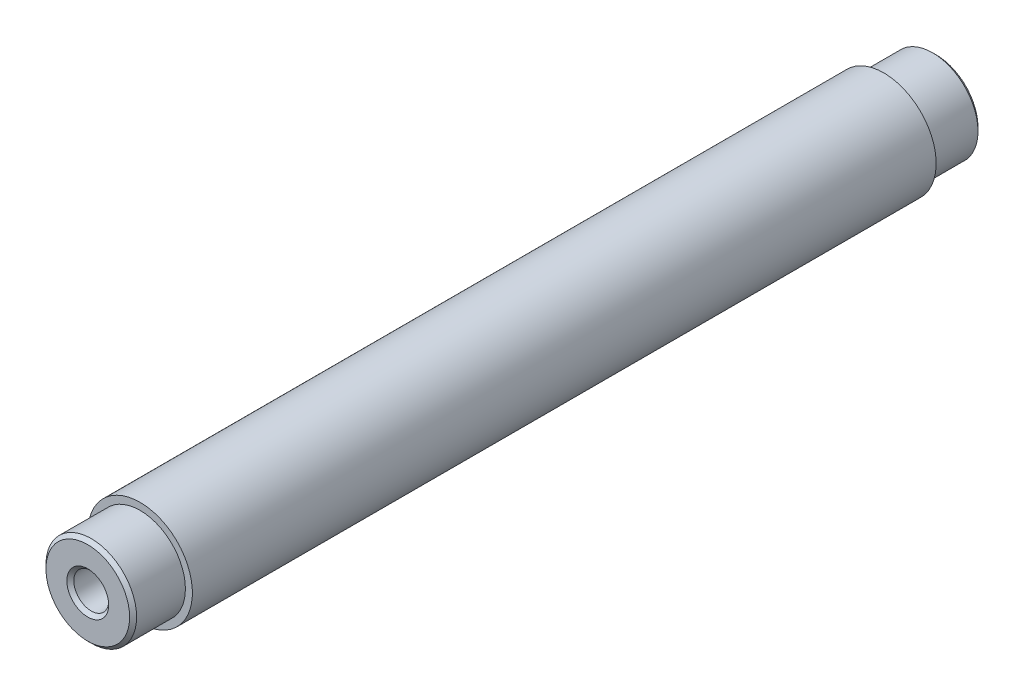
ISO-10303-21;
HEADER;
FILE_DESCRIPTION(('STEP AP214'),'2;1');
FILE_NAME('part.step','',(''),(''),'','','');
FILE_SCHEMA(('AUTOMOTIVE_DESIGN { 1 0 10303 214 1 1 1 1 }'));
ENDSEC;
DATA;
#1=APPLICATION_CONTEXT('core data for automotive mechanical design processes');
#2=APPLICATION_PROTOCOL_DEFINITION('international standard','automotive_design',2000,#1);
#3=PRODUCT_CONTEXT('',#1,'mechanical');
#4=PRODUCT('Part','Part','',(#3));
#5=PRODUCT_RELATED_PRODUCT_CATEGORY('part','',(#4));
#6=PRODUCT_DEFINITION_FORMATION('','',#4);
#7=PRODUCT_DEFINITION_CONTEXT('part definition',#1,'design');
#8=PRODUCT_DEFINITION('design','',#6,#7);
#9=PRODUCT_DEFINITION_SHAPE('','',#8);
#10=(LENGTH_UNIT() NAMED_UNIT(*) SI_UNIT(.MILLI.,.METRE.));
#11=(NAMED_UNIT(*) PLANE_ANGLE_UNIT() SI_UNIT($,.RADIAN.));
#12=(NAMED_UNIT(*) SI_UNIT($,.STERADIAN.) SOLID_ANGLE_UNIT());
#13=UNCERTAINTY_MEASURE_WITH_UNIT(LENGTH_MEASURE(1.E-05),#10,'distance_accuracy_value','');
#14=(GEOMETRIC_REPRESENTATION_CONTEXT(3) GLOBAL_UNCERTAINTY_ASSIGNED_CONTEXT((#13)) GLOBAL_UNIT_ASSIGNED_CONTEXT((#10,
#11,#12)) REPRESENTATION_CONTEXT('',''));
#15=CARTESIAN_POINT('',(0.,0.,0.));
#16=DIRECTION('',(0.,0.,1.));
#17=DIRECTION('',(1.,0.,0.));
#18=AXIS2_PLACEMENT_3D('',#15,#16,#17);
#19=CARTESIAN_POINT('',(0.,0.,60.825));
#20=DIRECTION('',(0.,0.,-1.));
#21=DIRECTION('',(-1.,0.,0.));
#22=AXIS2_PLACEMENT_3D('',#19,#20,#21);
#23=CYLINDRICAL_SURFACE('',#22,7.5);
#24=CARTESIAN_POINT('',(0.,0.,-53.325));
#25=DIRECTION('',(0.,0.,-1.));
#26=DIRECTION('',(-1.,0.,0.));
#27=AXIS2_PLACEMENT_3D('',#24,#25,#26);
#28=CIRCLE('',#27,7.5);
#29=CARTESIAN_POINT('',(-7.5,0.,-53.325));
#30=VERTEX_POINT('',#29);
#31=EDGE_CURVE('E89',#30,#30,#28,.T.);
#32=CARTESIAN_POINT('',(0.,0.,53.325));
#33=DIRECTION('',(0.,0.,-1.));
#34=DIRECTION('',(-1.,0.,0.));
#35=AXIS2_PLACEMENT_3D('',#32,#33,#34);
#36=CIRCLE('',#35,7.5);
#37=CARTESIAN_POINT('',(-7.5,0.,53.325));
#38=VERTEX_POINT('',#37);
#39=EDGE_CURVE('E79',#38,#38,#36,.T.);
#40=CARTESIAN_POINT('',(-7.5,0.,-53.325));
#41=CARTESIAN_POINT('',(-7.5,0.,-52.2140625));
#42=CARTESIAN_POINT('',(-7.5,0.,-51.103125));
#43=CARTESIAN_POINT('',(-7.5,0.,-48.88125));
#44=CARTESIAN_POINT('',(-7.5,0.,-47.7703125));
#45=CARTESIAN_POINT('',(-7.5,0.,-45.5484375));
#46=CARTESIAN_POINT('',(-7.5,0.,-44.4375));
#47=CARTESIAN_POINT('',(-7.5,0.,-42.215625));
#48=CARTESIAN_POINT('',(-7.5,0.,-41.1046875));
#49=CARTESIAN_POINT('',(-7.5,0.,-38.8828125));
#50=CARTESIAN_POINT('',(-7.5,0.,-37.771875));
#51=CARTESIAN_POINT('',(-7.5,0.,-35.55));
#52=CARTESIAN_POINT('',(-7.5,0.,-34.4390625));
#53=CARTESIAN_POINT('',(-7.5,0.,-32.2171875));
#54=CARTESIAN_POINT('',(-7.5,0.,-31.10625));
#55=CARTESIAN_POINT('',(-7.5,0.,-28.884375));
#56=CARTESIAN_POINT('',(-7.5,0.,-27.7734375));
#57=CARTESIAN_POINT('',(-7.5,0.,-25.5515625));
#58=CARTESIAN_POINT('',(-7.5,0.,-24.440625));
#59=CARTESIAN_POINT('',(-7.5,0.,-22.21875));
#60=CARTESIAN_POINT('',(-7.5,0.,-21.1078125));
#61=CARTESIAN_POINT('',(-7.5,0.,-18.8859375));
#62=CARTESIAN_POINT('',(-7.5,0.,-17.775));
#63=CARTESIAN_POINT('',(-7.5,0.,-15.553125));
#64=CARTESIAN_POINT('',(-7.5,0.,-14.4421875));
#65=CARTESIAN_POINT('',(-7.5,0.,-12.2203125));
#66=CARTESIAN_POINT('',(-7.5,0.,-11.109375));
#67=CARTESIAN_POINT('',(-7.5,0.,-8.8875));
#68=CARTESIAN_POINT('',(-7.5,0.,-7.7765625));
#69=CARTESIAN_POINT('',(-7.5,0.,-5.5546875));
#70=CARTESIAN_POINT('',(-7.5,0.,-4.44375));
#71=CARTESIAN_POINT('',(-7.5,0.,-2.221875));
#72=CARTESIAN_POINT('',(-7.5,0.,-1.1109375));
#73=CARTESIAN_POINT('',(-7.5,0.,1.1109375));
#74=CARTESIAN_POINT('',(-7.5,0.,2.221875));
#75=CARTESIAN_POINT('',(-7.5,0.,4.44375));
#76=CARTESIAN_POINT('',(-7.5,0.,5.5546875));
#77=CARTESIAN_POINT('',(-7.5,0.,7.7765625));
#78=CARTESIAN_POINT('',(-7.5,0.,8.8875));
#79=CARTESIAN_POINT('',(-7.5,0.,11.109375));
#80=CARTESIAN_POINT('',(-7.5,0.,12.2203125));
#81=CARTESIAN_POINT('',(-7.5,0.,14.4421875));
#82=CARTESIAN_POINT('',(-7.5,0.,15.553125));
#83=CARTESIAN_POINT('',(-7.5,0.,17.775));
#84=CARTESIAN_POINT('',(-7.5,0.,18.8859375));
#85=CARTESIAN_POINT('',(-7.5,0.,21.1078125));
#86=CARTESIAN_POINT('',(-7.5,0.,22.21875));
#87=CARTESIAN_POINT('',(-7.5,0.,24.440625));
#88=CARTESIAN_POINT('',(-7.5,0.,25.5515625));
#89=CARTESIAN_POINT('',(-7.5,0.,27.7734375));
#90=CARTESIAN_POINT('',(-7.5,0.,28.884375));
#91=CARTESIAN_POINT('',(-7.5,0.,31.10625));
#92=CARTESIAN_POINT('',(-7.5,0.,32.2171875));
#93=CARTESIAN_POINT('',(-7.5,0.,34.4390625));
#94=CARTESIAN_POINT('',(-7.5,0.,35.55));
#95=CARTESIAN_POINT('',(-7.5,0.,37.771875));
#96=CARTESIAN_POINT('',(-7.5,0.,38.8828125));
#97=CARTESIAN_POINT('',(-7.5,0.,41.1046875));
#98=CARTESIAN_POINT('',(-7.5,0.,42.215625));
#99=CARTESIAN_POINT('',(-7.5,0.,44.4375));
#100=CARTESIAN_POINT('',(-7.5,0.,45.5484375));
#101=CARTESIAN_POINT('',(-7.5,0.,47.7703125));
#102=CARTESIAN_POINT('',(-7.5,0.,48.88125));
#103=CARTESIAN_POINT('',(-7.5,0.,51.103125));
#104=CARTESIAN_POINT('',(-7.5,0.,52.2140625));
#105=CARTESIAN_POINT('',(-7.5,0.,53.325));
#106=B_SPLINE_CURVE_WITH_KNOTS('',3,(#40,#41,#42,#43,#44,#45,#46,#47,#48,#49,#50,#51,#52,#53,
#54,#55,#56,#57,#58,#59,#60,#61,#62,#63,#64,#65,#66,#67,#68,#69,#70,#71,#72,#73,#74,#75,#76,#77,
#78,#79,#80,#81,#82,#83,#84,#85,#86,#87,#88,#89,#90,#91,#92,#93,#94,#95,#96,#97,#98,#99,#100,
#101,#102,#103,#104,#105),.UNSPECIFIED.,.F.,.F.,(4,2,2,2,2,2,2,2,2,2,2,2,2,2,2,2,2,2,2,2,2,2,2,
2,2,2,2,2,2,2,2,2,4),(0.,3.3328125,6.66562500000001,9.9984375,13.33125,16.6640625,19.996875,
23.3296875,26.6625,29.9953125,33.328125,36.6609375,39.99375,43.3265625,46.659375,49.9921875,
53.325,56.6578125,59.990625,63.3234375,66.65625,69.9890625,73.321875,76.6546875,79.9875,
83.3203125,86.653125,89.9859375,93.31875,96.6515625,99.984375,103.3171875,106.65),.UNSPECIFIED.);
#107=EDGE_CURVE('BSEAM51',#30,#38,#106,.T.);
#108=ORIENTED_EDGE('',*,*,#31,.F.);
#109=ORIENTED_EDGE('',*,*,#39,.T.);
#110=ORIENTED_EDGE('',*,*,#107,.T.);
#111=ORIENTED_EDGE('',*,*,#107,.F.);
#112=EDGE_LOOP('',(#108,#110,#109,#111));
#113=FACE_BOUND('',#112,.T.);
#114=ADVANCED_FACE('F51',(#113),#23,.T.);
#115=CARTESIAN_POINT('',(0.,0.,-53.325));
#116=DIRECTION('',(0.,0.,-1.));
#117=DIRECTION('',(-1.,0.,0.));
#118=AXIS2_PLACEMENT_3D('',#115,#116,#117);
#119=CYLINDRICAL_SURFACE('',#118,6.5);
#120=CARTESIAN_POINT('',(0.,0.,-60.325));
#121=DIRECTION('',(0.,0.,1.));
#122=DIRECTION('',(1.,0.,0.));
#123=AXIS2_PLACEMENT_3D('',#120,#121,#122);
#124=CIRCLE('',#123,6.5);
#125=CARTESIAN_POINT('',(6.5,0.,-60.325));
#126=VERTEX_POINT('',#125);
#127=EDGE_CURVE('E100',#126,#126,#124,.T.);
#128=ORIENTED_EDGE('',*,*,#127,.T.);
#129=EDGE_LOOP('',(#128));
#130=FACE_BOUND('',#129,.T.);
#131=CARTESIAN_POINT('',(0.,0.,-53.325));
#132=DIRECTION('',(0.,0.,-1.));
#133=DIRECTION('',(-1.,0.,0.));
#134=AXIS2_PLACEMENT_3D('',#131,#132,#133);
#135=CIRCLE('',#134,6.5);
#136=CARTESIAN_POINT('',(-6.5,0.,-53.325));
#137=VERTEX_POINT('',#136);
#138=EDGE_CURVE('E90',#137,#137,#135,.T.);
#139=ORIENTED_EDGE('',*,*,#138,.T.);
#140=EDGE_LOOP('',(#139));
#141=FACE_BOUND('',#140,.T.);
#142=ADVANCED_FACE('F133',(#130,#141),#119,.T.);
#143=CARTESIAN_POINT('',(0.,0.,-53.325));
#144=DIRECTION('',(0.,0.,-1.));
#145=DIRECTION('',(-1.,0.,0.));
#146=AXIS2_PLACEMENT_3D('',#143,#144,#145);
#147=PLANE('',#146);
#148=ORIENTED_EDGE('',*,*,#138,.F.);
#149=EDGE_LOOP('',(#148));
#150=FACE_BOUND('',#149,.T.);
#151=ORIENTED_EDGE('',*,*,#31,.T.);
#152=EDGE_LOOP('',(#151));
#153=FACE_BOUND('',#152,.T.);
#154=ADVANCED_FACE('F136',(#150,#153),#147,.T.);
#155=CARTESIAN_POINT('',(0.,0.,-60.825));
#156=DIRECTION('',(0.,0.,1.));
#157=DIRECTION('',(1.,0.,0.));
#158=AXIS2_PLACEMENT_3D('',#155,#156,#157);
#159=PLANE('',#158);
#160=CARTESIAN_POINT('',(0.,0.,-60.825));
#161=DIRECTION('',(0.,0.,1.));
#162=DIRECTION('',(1.,0.,0.));
#163=AXIS2_PLACEMENT_3D('',#160,#161,#162);
#164=CIRCLE('',#163,5.99999999999999);
#165=CARTESIAN_POINT('',(5.99999999999999,0.,-60.825));
#166=VERTEX_POINT('',#165);
#167=EDGE_CURVE('E98',#166,#166,#164,.F.);
#168=ORIENTED_EDGE('',*,*,#167,.T.);
#169=EDGE_LOOP('',(#168));
#170=FACE_BOUND('',#169,.T.);
#171=CARTESIAN_POINT('',(0.,0.,-60.825));
#172=DIRECTION('',(0.,0.,1.));
#173=DIRECTION('',(1.,0.,0.));
#174=AXIS2_PLACEMENT_3D('',#171,#172,#173);
#175=CIRCLE('',#174,3.);
#176=CARTESIAN_POINT('',(3.,0.,-60.825));
#177=VERTEX_POINT('',#176);
#178=EDGE_CURVE('E94',#177,#177,#175,.T.);
#179=ORIENTED_EDGE('',*,*,#178,.T.);
#180=EDGE_LOOP('',(#179));
#181=FACE_BOUND('',#180,.T.);
#182=ADVANCED_FACE('F147',(#170,#181),#159,.F.);
#183=CARTESIAN_POINT('',(0.,0.,-45.3271515475689));
#184=DIRECTION('',(0.,0.,-1.));
#185=DIRECTION('',(-1.,0.,0.));
#186=AXIS2_PLACEMENT_3D('',#183,#184,#185);
#187=CONICAL_SURFACE('',#186,2.5,1.02974425867665);
#188=CARTESIAN_POINT('',(0.,0.,-43.825));
#189=VERTEX_POINT('',#188);
#190=VERTEX_LOOP('',#189);
#191=FACE_BOUND('',#190,.T.);
#192=CARTESIAN_POINT('',(0.,0.,-45.3271515475689));
#193=DIRECTION('',(0.,0.,-1.));
#194=DIRECTION('',(-1.,0.,0.));
#195=AXIS2_PLACEMENT_3D('',#192,#193,#194);
#196=CIRCLE('',#195,2.5);
#197=CARTESIAN_POINT('',(-2.5,0.,-45.3271515475689));
#198=VERTEX_POINT('',#197);
#199=EDGE_CURVE('E81',#198,#198,#196,.T.);
#200=ORIENTED_EDGE('',*,*,#199,.T.);
#201=EDGE_LOOP('',(#200));
#202=FACE_BOUND('',#201,.T.);
#203=ADVANCED_FACE('F167',(#191,#202),#187,.F.);
#204=CARTESIAN_POINT('',(0.,0.,-60.825));
#205=DIRECTION('',(0.,0.,-1.));
#206=DIRECTION('',(-1.,0.,0.));
#207=AXIS2_PLACEMENT_3D('',#204,#205,#206);
#208=CYLINDRICAL_SURFACE('',#207,2.5);
#209=CARTESIAN_POINT('',(0.,0.,-60.325));
#210=DIRECTION('',(0.,0.,1.));
#211=DIRECTION('',(1.,0.,0.));
#212=AXIS2_PLACEMENT_3D('',#209,#210,#211);
#213=CIRCLE('',#212,2.5);
#214=CARTESIAN_POINT('',(2.5,0.,-60.325));
#215=VERTEX_POINT('',#214);
#216=EDGE_CURVE('E11',#215,#215,#213,.F.);
#217=ORIENTED_EDGE('',*,*,#216,.T.);
#218=EDGE_LOOP('',(#217));
#219=FACE_BOUND('',#218,.T.);
#220=ORIENTED_EDGE('',*,*,#199,.F.);
#221=EDGE_LOOP('',(#220));
#222=FACE_BOUND('',#221,.T.);
#223=ADVANCED_FACE('F174',(#219,#222),#208,.F.);
#224=CARTESIAN_POINT('',(0.,0.,53.325));
#225=DIRECTION('',(0.,0.,1.));
#226=DIRECTION('',(1.,0.,0.));
#227=AXIS2_PLACEMENT_3D('',#224,#225,#226);
#228=CYLINDRICAL_SURFACE('',#227,6.5);
#229=CARTESIAN_POINT('',(0.,0.,60.325));
#230=DIRECTION('',(0.,0.,1.));
#231=DIRECTION('',(1.,0.,0.));
#232=AXIS2_PLACEMENT_3D('',#229,#230,#231);
#233=CIRCLE('',#232,6.5);
#234=CARTESIAN_POINT('',(6.5,0.,60.325));
#235=VERTEX_POINT('',#234);
#236=EDGE_CURVE('E105',#235,#235,#233,.F.);
#237=ORIENTED_EDGE('',*,*,#236,.T.);
#238=EDGE_LOOP('',(#237));
#239=FACE_BOUND('',#238,.T.);
#240=CARTESIAN_POINT('',(0.,0.,53.325));
#241=DIRECTION('',(0.,0.,-1.));
#242=DIRECTION('',(-1.,0.,0.));
#243=AXIS2_PLACEMENT_3D('',#240,#241,#242);
#244=CIRCLE('',#243,6.5);
#245=CARTESIAN_POINT('',(-6.5,0.,53.325));
#246=VERTEX_POINT('',#245);
#247=EDGE_CURVE('E77',#246,#246,#244,.T.);
#248=ORIENTED_EDGE('',*,*,#247,.F.);
#249=EDGE_LOOP('',(#248));
#250=FACE_BOUND('',#249,.T.);
#251=ADVANCED_FACE('F178',(#239,#250),#228,.T.);
#252=CARTESIAN_POINT('',(0.,0.,53.325));
#253=DIRECTION('',(0.,0.,1.));
#254=DIRECTION('',(-1.,0.,0.));
#255=AXIS2_PLACEMENT_3D('',#252,#253,#254);
#256=PLANE('',#255);
#257=ORIENTED_EDGE('',*,*,#247,.T.);
#258=EDGE_LOOP('',(#257));
#259=FACE_BOUND('',#258,.T.);
#260=ORIENTED_EDGE('',*,*,#39,.F.);
#261=EDGE_LOOP('',(#260));
#262=FACE_BOUND('',#261,.T.);
#263=ADVANCED_FACE('F186',(#259,#262),#256,.T.);
#264=CARTESIAN_POINT('',(0.,0.,60.825));
#265=DIRECTION('',(0.,0.,1.));
#266=DIRECTION('',(1.,0.,0.));
#267=AXIS2_PLACEMENT_3D('',#264,#265,#266);
#268=PLANE('',#267);
#269=CARTESIAN_POINT('',(0.,0.,60.825));
#270=DIRECTION('',(0.,0.,1.));
#271=DIRECTION('',(1.,0.,0.));
#272=AXIS2_PLACEMENT_3D('',#269,#270,#271);
#273=CIRCLE('',#272,5.99999999999999);
#274=CARTESIAN_POINT('',(5.99999999999999,0.,60.825));
#275=VERTEX_POINT('',#274);
#276=EDGE_CURVE('E108',#275,#275,#273,.T.);
#277=ORIENTED_EDGE('',*,*,#276,.T.);
#278=EDGE_LOOP('',(#277));
#279=FACE_BOUND('',#278,.T.);
#280=CARTESIAN_POINT('',(0.,0.,60.825));
#281=DIRECTION('',(0.,0.,1.));
#282=DIRECTION('',(1.,0.,0.));
#283=AXIS2_PLACEMENT_3D('',#280,#281,#282);
#284=CIRCLE('',#283,3.);
#285=CARTESIAN_POINT('',(3.,0.,60.825));
#286=VERTEX_POINT('',#285);
#287=EDGE_CURVE('E102',#286,#286,#284,.F.);
#288=ORIENTED_EDGE('',*,*,#287,.T.);
#289=EDGE_LOOP('',(#288));
#290=FACE_BOUND('',#289,.T.);
#291=ADVANCED_FACE('F69',(#279,#290),#268,.T.);
#292=CARTESIAN_POINT('',(0.,0.,45.3271515475689));
#293=DIRECTION('',(0.,0.,1.));
#294=DIRECTION('',(1.,0.,0.));
#295=AXIS2_PLACEMENT_3D('',#292,#293,#294);
#296=CONICAL_SURFACE('',#295,2.5,1.02974425867665);
#297=CARTESIAN_POINT('',(0.,0.,43.825));
#298=VERTEX_POINT('',#297);
#299=VERTEX_LOOP('',#298);
#300=FACE_BOUND('',#299,.T.);
#301=CARTESIAN_POINT('',(0.,0.,45.3271515475689));
#302=DIRECTION('',(0.,0.,1.));
#303=DIRECTION('',(1.,0.,0.));
#304=AXIS2_PLACEMENT_3D('',#301,#302,#303);
#305=CIRCLE('',#304,2.5);
#306=CARTESIAN_POINT('',(2.5,0.,45.3271515475689));
#307=VERTEX_POINT('',#306);
#308=EDGE_CURVE('E71',#307,#307,#305,.T.);
#309=ORIENTED_EDGE('',*,*,#308,.T.);
#310=EDGE_LOOP('',(#309));
#311=FACE_BOUND('',#310,.T.);
#312=ADVANCED_FACE('F68',(#300,#311),#296,.F.);
#313=CARTESIAN_POINT('',(0.,0.,60.825));
#314=DIRECTION('',(0.,0.,1.));
#315=DIRECTION('',(1.,0.,0.));
#316=AXIS2_PLACEMENT_3D('',#313,#314,#315);
#317=CYLINDRICAL_SURFACE('',#316,2.5);
#318=CARTESIAN_POINT('',(0.,0.,60.325));
#319=DIRECTION('',(0.,0.,1.));
#320=DIRECTION('',(1.,0.,0.));
#321=AXIS2_PLACEMENT_3D('',#318,#319,#320);
#322=CIRCLE('',#321,2.5);
#323=CARTESIAN_POINT('',(2.5,0.,60.325));
#324=VERTEX_POINT('',#323);
#325=EDGE_CURVE('E58',#324,#324,#322,.T.);
#326=ORIENTED_EDGE('',*,*,#325,.T.);
#327=EDGE_LOOP('',(#326));
#328=FACE_BOUND('',#327,.T.);
#329=ORIENTED_EDGE('',*,*,#308,.F.);
#330=EDGE_LOOP('',(#329));
#331=FACE_BOUND('',#330,.T.);
#332=ADVANCED_FACE('F67',(#328,#331),#317,.F.);
#333=CARTESIAN_POINT('',(0.,0.,-60.825));
#334=DIRECTION('',(0.,0.,1.));
#335=DIRECTION('',(1.,0.,0.));
#336=AXIS2_PLACEMENT_3D('',#333,#334,#335);
#337=CONICAL_SURFACE('',#336,5.99999999999999,0.785398163397442);
#338=ORIENTED_EDGE('',*,*,#127,.F.);
#339=EDGE_LOOP('',(#338));
#340=FACE_BOUND('',#339,.T.);
#341=ORIENTED_EDGE('',*,*,#167,.F.);
#342=EDGE_LOOP('',(#341));
#343=FACE_BOUND('',#342,.T.);
#344=ADVANCED_FACE('F123',(#340,#343),#337,.T.);
#345=CARTESIAN_POINT('',(0.,0.,60.325));
#346=DIRECTION('',(0.,0.,-1.));
#347=DIRECTION('',(-1.,0.,0.));
#348=AXIS2_PLACEMENT_3D('',#345,#346,#347);
#349=CONICAL_SURFACE('',#348,6.5,0.785398163397456);
#350=ORIENTED_EDGE('',*,*,#276,.F.);
#351=EDGE_LOOP('',(#350));
#352=FACE_BOUND('',#351,.T.);
#353=ORIENTED_EDGE('',*,*,#236,.F.);
#354=EDGE_LOOP('',(#353));
#355=FACE_BOUND('',#354,.T.);
#356=ADVANCED_FACE('F116',(#352,#355),#349,.T.);
#357=CARTESIAN_POINT('',(0.,0.,60.325));
#358=DIRECTION('',(0.,0.,1.));
#359=DIRECTION('',(1.,0.,0.));
#360=AXIS2_PLACEMENT_3D('',#357,#358,#359);
#361=CONICAL_SURFACE('',#360,2.5,0.78539816339744);
#362=ORIENTED_EDGE('',*,*,#287,.F.);
#363=EDGE_LOOP('',(#362));
#364=FACE_BOUND('',#363,.T.);
#365=ORIENTED_EDGE('',*,*,#325,.F.);
#366=EDGE_LOOP('',(#365));
#367=FACE_BOUND('',#366,.T.);
#368=ADVANCED_FACE('F112',(#364,#367),#361,.F.);
#369=CARTESIAN_POINT('',(0.,0.,-60.325));
#370=DIRECTION('',(0.,0.,-1.));
#371=DIRECTION('',(-1.,0.,0.));
#372=AXIS2_PLACEMENT_3D('',#369,#370,#371);
#373=CONICAL_SURFACE('',#372,2.5,0.78539816339744);
#374=ORIENTED_EDGE('',*,*,#178,.F.);
#375=EDGE_LOOP('',(#374));
#376=FACE_BOUND('',#375,.T.);
#377=ORIENTED_EDGE('',*,*,#216,.F.);
#378=EDGE_LOOP('',(#377));
#379=FACE_BOUND('',#378,.T.);
#380=ADVANCED_FACE('F53',(#376,#379),#373,.F.);
#381=CLOSED_SHELL('',(#114,#142,#154,#182,#203,#223,#251,#263,#291,#312,#332,#344,#356,#368,#380));
#382=MANIFOLD_SOLID_BREP('B2',#381);
#383=ADVANCED_BREP_SHAPE_REPRESENTATION('',(#18,#382),#14);
#384=SHAPE_DEFINITION_REPRESENTATION(#9,#383);
ENDSEC;
END-ISO-10303-21;
